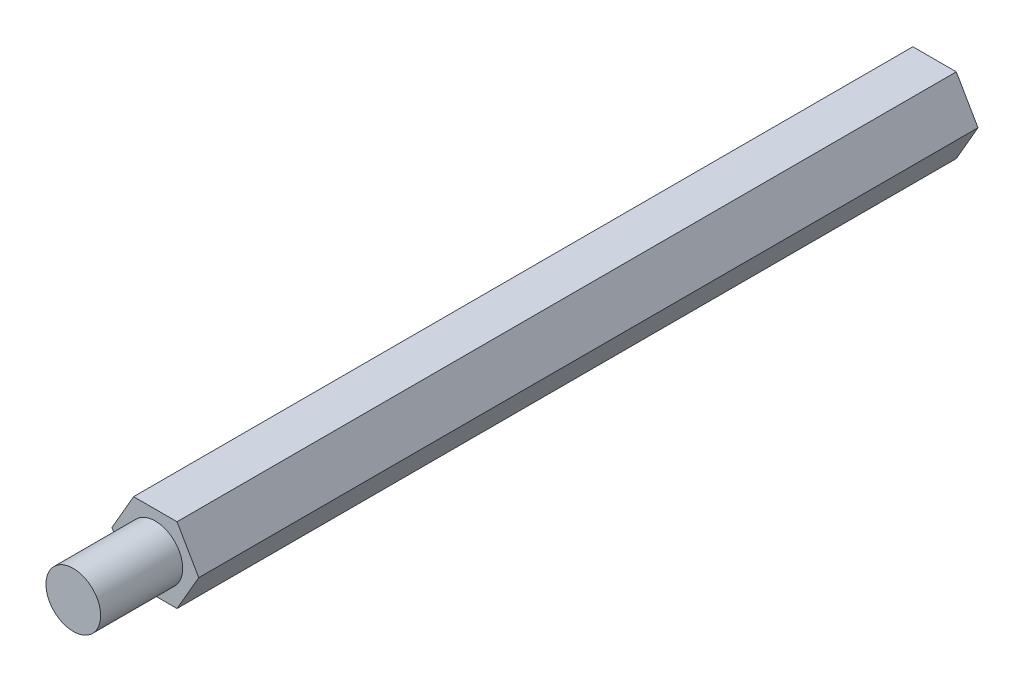
ISO-10303-21;
HEADER;
FILE_DESCRIPTION(('STEP AP214'),'2;1');
FILE_NAME('part.step','',(''),(''),'','','');
FILE_SCHEMA(('AUTOMOTIVE_DESIGN { 1 0 10303 214 1 1 1 1 }'));
ENDSEC;
DATA;
#1=APPLICATION_CONTEXT('core data for automotive mechanical design processes');
#2=APPLICATION_PROTOCOL_DEFINITION('international standard','automotive_design',2000,#1);
#3=PRODUCT_CONTEXT('',#1,'mechanical');
#4=PRODUCT('Part','Part','',(#3));
#5=PRODUCT_RELATED_PRODUCT_CATEGORY('part','',(#4));
#6=PRODUCT_DEFINITION_FORMATION('','',#4);
#7=PRODUCT_DEFINITION_CONTEXT('part definition',#1,'design');
#8=PRODUCT_DEFINITION('design','',#6,#7);
#9=PRODUCT_DEFINITION_SHAPE('','',#8);
#10=(LENGTH_UNIT() NAMED_UNIT(*) SI_UNIT(.MILLI.,.METRE.));
#11=(NAMED_UNIT(*) PLANE_ANGLE_UNIT() SI_UNIT($,.RADIAN.));
#12=(NAMED_UNIT(*) SI_UNIT($,.STERADIAN.) SOLID_ANGLE_UNIT());
#13=UNCERTAINTY_MEASURE_WITH_UNIT(LENGTH_MEASURE(1.E-05),#10,'distance_accuracy_value','');
#14=(GEOMETRIC_REPRESENTATION_CONTEXT(3) GLOBAL_UNCERTAINTY_ASSIGNED_CONTEXT((#13)) GLOBAL_UNIT_ASSIGNED_CONTEXT((#10,
#11,#12)) REPRESENTATION_CONTEXT('',''));
#15=CARTESIAN_POINT('',(0.,0.,0.));
#16=DIRECTION('',(0.,0.,1.));
#17=DIRECTION('',(1.,0.,0.));
#18=AXIS2_PLACEMENT_3D('',#15,#16,#17);
#19=CARTESIAN_POINT('',(1.58771324027147,-2.75,57.));
#20=DIRECTION('',(0.,0.,1.));
#21=DIRECTION('',(1.,0.,0.));
#22=AXIS2_PLACEMENT_3D('',#19,#20,#21);
#23=PLANE('',#22);
#24=DIRECTION('',(1.,0.,0.));
#25=VECTOR('',#24,1.);
#26=CARTESIAN_POINT('',(-1.58771324027147,-2.75,57.));
#27=LINE('',#26,#25);
#28=CARTESIAN_POINT('',(-1.58771324027147,-2.75,57.));
#29=VERTEX_POINT('',#28);
#30=CARTESIAN_POINT('',(1.58771324027147,-2.75,57.));
#31=VERTEX_POINT('',#30);
#32=EDGE_CURVE('E129',#29,#31,#27,.T.);
#33=ORIENTED_EDGE('',*,*,#32,.T.);
#34=DIRECTION('',(0.5,0.866025403784439,0.));
#35=VECTOR('',#34,1.);
#36=CARTESIAN_POINT('',(1.58771324027147,-2.75,57.));
#37=LINE('',#36,#35);
#38=CARTESIAN_POINT('',(3.17542648054294,0.,57.));
#39=VERTEX_POINT('',#38);
#40=EDGE_CURVE('E87',#31,#39,#37,.T.);
#41=ORIENTED_EDGE('',*,*,#40,.T.);
#42=DIRECTION('',(-0.5,0.866025403784438,0.));
#43=VECTOR('',#42,1.);
#44=CARTESIAN_POINT('',(3.17542648054294,0.,57.));
#45=LINE('',#44,#43);
#46=CARTESIAN_POINT('',(1.58771324027147,2.75,57.));
#47=VERTEX_POINT('',#46);
#48=EDGE_CURVE('E100',#39,#47,#45,.T.);
#49=ORIENTED_EDGE('',*,*,#48,.T.);
#50=DIRECTION('',(-1.,0.,0.));
#51=VECTOR('',#50,1.);
#52=CARTESIAN_POINT('',(1.58771324027147,2.75,57.));
#53=LINE('',#52,#51);
#54=CARTESIAN_POINT('',(-1.58771324027147,2.75,57.));
#55=VERTEX_POINT('',#54);
#56=EDGE_CURVE('E94',#47,#55,#53,.T.);
#57=ORIENTED_EDGE('',*,*,#56,.T.);
#58=DIRECTION('',(-0.5,-0.866025403784439,0.));
#59=VECTOR('',#58,1.);
#60=CARTESIAN_POINT('',(-1.58771324027147,2.75,57.));
#61=LINE('',#60,#59);
#62=CARTESIAN_POINT('',(-3.17542648054294,0.,57.));
#63=VERTEX_POINT('',#62);
#64=EDGE_CURVE('E98',#55,#63,#61,.T.);
#65=ORIENTED_EDGE('',*,*,#64,.T.);
#66=DIRECTION('',(0.5,-0.866025403784438,0.));
#67=VECTOR('',#66,1.);
#68=CARTESIAN_POINT('',(-3.17542648054294,0.,57.));
#69=LINE('',#68,#67);
#70=EDGE_CURVE('E50',#63,#29,#69,.T.);
#71=ORIENTED_EDGE('',*,*,#70,.T.);
#72=EDGE_LOOP('',(#33,#41,#49,#57,#65,#71));
#73=FACE_BOUND('',#72,.T.);
#74=CARTESIAN_POINT('',(0.,0.,57.));
#75=DIRECTION('',(0.,0.,1.));
#76=DIRECTION('',(1.,0.,0.));
#77=AXIS2_PLACEMENT_3D('',#74,#75,#76);
#78=CIRCLE('',#77,2.);
#79=CARTESIAN_POINT('',(2.,0.,57.));
#80=VERTEX_POINT('',#79);
#81=EDGE_CURVE('E179',#80,#80,#78,.T.);
#82=ORIENTED_EDGE('',*,*,#81,.F.);
#83=EDGE_LOOP('',(#82));
#84=FACE_BOUND('',#83,.T.);
#85=ADVANCED_FACE('F33',(#73,#84),#23,.T.);
#86=CARTESIAN_POINT('',(-1.58771324027147,-2.75,57.));
#87=DIRECTION('',(0.,1.,0.));
#88=DIRECTION('',(0.,0.,1.));
#89=AXIS2_PLACEMENT_3D('',#86,#87,#88);
#90=PLANE('',#89);
#91=DIRECTION('',(1.,0.,0.));
#92=VECTOR('',#91,1.);
#93=CARTESIAN_POINT('',(-1.58771324027147,-2.75,0.));
#94=LINE('',#93,#92);
#95=CARTESIAN_POINT('',(-1.58771324027147,-2.75,0.));
#96=VERTEX_POINT('',#95);
#97=CARTESIAN_POINT('',(1.58771324027147,-2.75,0.));
#98=VERTEX_POINT('',#97);
#99=EDGE_CURVE('E118',#96,#98,#94,.T.);
#100=ORIENTED_EDGE('',*,*,#99,.T.);
#101=DIRECTION('',(0.,0.,-1.));
#102=VECTOR('',#101,1.);
#103=CARTESIAN_POINT('',(1.58771324027147,-2.75,57.));
#104=LINE('',#103,#102);
#105=EDGE_CURVE('E11',#31,#98,#104,.T.);
#106=ORIENTED_EDGE('',*,*,#105,.F.);
#107=ORIENTED_EDGE('',*,*,#32,.F.);
#108=DIRECTION('',(0.,0.,-1.));
#109=VECTOR('',#108,1.);
#110=CARTESIAN_POINT('',(-1.58771324027147,-2.75,57.));
#111=LINE('',#110,#109);
#112=EDGE_CURVE('E114',#29,#96,#111,.T.);
#113=ORIENTED_EDGE('',*,*,#112,.T.);
#114=EDGE_LOOP('',(#100,#106,#107,#113));
#115=FACE_BOUND('',#114,.T.);
#116=ADVANCED_FACE('F35',(#115),#90,.F.);
#117=CARTESIAN_POINT('',(1.58771324027147,-2.75,57.));
#118=DIRECTION('',(-0.866025403784439,0.5,0.));
#119=DIRECTION('',(-0.5,-0.866025403784439,0.));
#120=AXIS2_PLACEMENT_3D('',#117,#118,#119);
#121=PLANE('',#120);
#122=DIRECTION('',(0.5,0.866025403784439,0.));
#123=VECTOR('',#122,1.);
#124=CARTESIAN_POINT('',(1.58771324027147,-2.75,0.));
#125=LINE('',#124,#123);
#126=CARTESIAN_POINT('',(3.17542648054294,0.,0.));
#127=VERTEX_POINT('',#126);
#128=EDGE_CURVE('E121',#98,#127,#125,.T.);
#129=ORIENTED_EDGE('',*,*,#128,.T.);
#130=DIRECTION('',(0.,0.,-1.));
#131=VECTOR('',#130,1.);
#132=CARTESIAN_POINT('',(3.17542648054294,0.,57.));
#133=LINE('',#132,#131);
#134=EDGE_CURVE('E42',#39,#127,#133,.T.);
#135=ORIENTED_EDGE('',*,*,#134,.F.);
#136=ORIENTED_EDGE('',*,*,#40,.F.);
#137=ORIENTED_EDGE('',*,*,#105,.T.);
#138=EDGE_LOOP('',(#129,#135,#136,#137));
#139=FACE_BOUND('',#138,.T.);
#140=ADVANCED_FACE('F158',(#139),#121,.F.);
#141=CARTESIAN_POINT('',(3.17542648054294,0.,57.));
#142=DIRECTION('',(-0.866025403784438,-0.5,0.));
#143=DIRECTION('',(0.5,-0.866025403784439,0.));
#144=AXIS2_PLACEMENT_3D('',#141,#142,#143);
#145=PLANE('',#144);
#146=DIRECTION('',(-0.5,0.866025403784438,0.));
#147=VECTOR('',#146,1.);
#148=CARTESIAN_POINT('',(3.17542648054294,0.,0.));
#149=LINE('',#148,#147);
#150=CARTESIAN_POINT('',(1.58771324027147,2.75,0.));
#151=VERTEX_POINT('',#150);
#152=EDGE_CURVE('E124',#127,#151,#149,.T.);
#153=ORIENTED_EDGE('',*,*,#152,.T.);
#154=DIRECTION('',(0.,0.,-1.));
#155=VECTOR('',#154,1.);
#156=CARTESIAN_POINT('',(1.58771324027147,2.75,57.));
#157=LINE('',#156,#155);
#158=EDGE_CURVE('E109',#47,#151,#157,.T.);
#159=ORIENTED_EDGE('',*,*,#158,.F.);
#160=ORIENTED_EDGE('',*,*,#48,.F.);
#161=ORIENTED_EDGE('',*,*,#134,.T.);
#162=EDGE_LOOP('',(#153,#159,#160,#161));
#163=FACE_BOUND('',#162,.T.);
#164=ADVANCED_FACE('F135',(#163),#145,.F.);
#165=CARTESIAN_POINT('',(1.58771324027147,2.75,57.));
#166=DIRECTION('',(0.,-1.,0.));
#167=DIRECTION('',(0.,0.,-1.));
#168=AXIS2_PLACEMENT_3D('',#165,#166,#167);
#169=PLANE('',#168);
#170=DIRECTION('',(-1.,0.,0.));
#171=VECTOR('',#170,1.);
#172=CARTESIAN_POINT('',(1.58771324027147,2.75,0.));
#173=LINE('',#172,#171);
#174=CARTESIAN_POINT('',(-1.58771324027147,2.75,0.));
#175=VERTEX_POINT('',#174);
#176=EDGE_CURVE('E108',#151,#175,#173,.T.);
#177=ORIENTED_EDGE('',*,*,#176,.T.);
#178=DIRECTION('',(0.,0.,-1.));
#179=VECTOR('',#178,1.);
#180=CARTESIAN_POINT('',(-1.58771324027147,2.75,57.));
#181=LINE('',#180,#179);
#182=EDGE_CURVE('E105',#55,#175,#181,.T.);
#183=ORIENTED_EDGE('',*,*,#182,.F.);
#184=ORIENTED_EDGE('',*,*,#56,.F.);
#185=ORIENTED_EDGE('',*,*,#158,.T.);
#186=EDGE_LOOP('',(#177,#183,#184,#185));
#187=FACE_BOUND('',#186,.T.);
#188=ADVANCED_FACE('F106',(#187),#169,.F.);
#189=CARTESIAN_POINT('',(-1.58771324027147,2.75,57.));
#190=DIRECTION('',(0.866025403784439,-0.5,0.));
#191=DIRECTION('',(0.5,0.866025403784439,0.));
#192=AXIS2_PLACEMENT_3D('',#189,#190,#191);
#193=PLANE('',#192);
#194=DIRECTION('',(-0.5,-0.866025403784439,0.));
#195=VECTOR('',#194,1.);
#196=CARTESIAN_POINT('',(-1.58771324027147,2.75,0.));
#197=LINE('',#196,#195);
#198=CARTESIAN_POINT('',(-3.17542648054294,0.,0.));
#199=VERTEX_POINT('',#198);
#200=EDGE_CURVE('E73',#175,#199,#197,.T.);
#201=ORIENTED_EDGE('',*,*,#200,.T.);
#202=DIRECTION('',(0.,0.,-1.));
#203=VECTOR('',#202,1.);
#204=CARTESIAN_POINT('',(-3.17542648054294,0.,57.));
#205=LINE('',#204,#203);
#206=EDGE_CURVE('E110',#63,#199,#205,.T.);
#207=ORIENTED_EDGE('',*,*,#206,.F.);
#208=ORIENTED_EDGE('',*,*,#64,.F.);
#209=ORIENTED_EDGE('',*,*,#182,.T.);
#210=EDGE_LOOP('',(#201,#207,#208,#209));
#211=FACE_BOUND('',#210,.T.);
#212=ADVANCED_FACE('F112',(#211),#193,.F.);
#213=CARTESIAN_POINT('',(-3.17542648054294,0.,57.));
#214=DIRECTION('',(0.866025403784438,0.5,0.));
#215=DIRECTION('',(-0.5,0.866025403784439,0.));
#216=AXIS2_PLACEMENT_3D('',#213,#214,#215);
#217=PLANE('',#216);
#218=DIRECTION('',(0.5,-0.866025403784438,0.));
#219=VECTOR('',#218,1.);
#220=CARTESIAN_POINT('',(-3.17542648054294,0.,0.));
#221=LINE('',#220,#219);
#222=EDGE_CURVE('E79',#199,#96,#221,.T.);
#223=ORIENTED_EDGE('',*,*,#222,.T.);
#224=ORIENTED_EDGE('',*,*,#112,.F.);
#225=ORIENTED_EDGE('',*,*,#70,.F.);
#226=ORIENTED_EDGE('',*,*,#206,.T.);
#227=EDGE_LOOP('',(#223,#224,#225,#226));
#228=FACE_BOUND('',#227,.T.);
#229=ADVANCED_FACE('F142',(#228),#217,.F.);
#230=CARTESIAN_POINT('',(1.58771324027147,-2.75,0.));
#231=DIRECTION('',(0.,0.,1.));
#232=DIRECTION('',(1.,0.,0.));
#233=AXIS2_PLACEMENT_3D('',#230,#231,#232);
#234=PLANE('',#233);
#235=CARTESIAN_POINT('',(0.,0.,0.));
#236=DIRECTION('',(0.,0.,-1.));
#237=DIRECTION('',(-1.,0.,0.));
#238=AXIS2_PLACEMENT_3D('',#235,#236,#237);
#239=CIRCLE('',#238,1.5);
#240=CARTESIAN_POINT('',(-1.5,0.,0.));
#241=VERTEX_POINT('',#240);
#242=EDGE_CURVE('E180',#241,#241,#239,.T.);
#243=ORIENTED_EDGE('',*,*,#242,.F.);
#244=EDGE_LOOP('',(#243));
#245=FACE_BOUND('',#244,.T.);
#246=ORIENTED_EDGE('',*,*,#99,.F.);
#247=ORIENTED_EDGE('',*,*,#222,.F.);
#248=ORIENTED_EDGE('',*,*,#200,.F.);
#249=ORIENTED_EDGE('',*,*,#176,.F.);
#250=ORIENTED_EDGE('',*,*,#152,.F.);
#251=ORIENTED_EDGE('',*,*,#128,.F.);
#252=EDGE_LOOP('',(#246,#247,#248,#249,#250,#251));
#253=FACE_BOUND('',#252,.T.);
#254=ADVANCED_FACE('F138',(#245,#253),#234,.F.);
#255=CARTESIAN_POINT('',(0.,0.,63.));
#256=DIRECTION('',(0.,0.,-1.));
#257=DIRECTION('',(-1.,0.,0.));
#258=AXIS2_PLACEMENT_3D('',#255,#256,#257);
#259=CYLINDRICAL_SURFACE('',#258,2.);
#260=CARTESIAN_POINT('',(0.,0.,63.));
#261=DIRECTION('',(0.,0.,1.));
#262=DIRECTION('',(1.,0.,0.));
#263=AXIS2_PLACEMENT_3D('',#260,#261,#262);
#264=CIRCLE('',#263,2.);
#265=CARTESIAN_POINT('',(2.,0.,63.));
#266=VERTEX_POINT('',#265);
#267=EDGE_CURVE('E122',#266,#266,#264,.T.);
#268=ORIENTED_EDGE('',*,*,#267,.F.);
#269=EDGE_LOOP('',(#268));
#270=FACE_BOUND('',#269,.T.);
#271=ORIENTED_EDGE('',*,*,#81,.T.);
#272=EDGE_LOOP('',(#271));
#273=FACE_BOUND('',#272,.T.);
#274=ADVANCED_FACE('F149',(#270,#273),#259,.T.);
#275=CARTESIAN_POINT('',(0.,0.,63.));
#276=DIRECTION('',(0.,0.,1.));
#277=DIRECTION('',(1.,0.,0.));
#278=AXIS2_PLACEMENT_3D('',#275,#276,#277);
#279=PLANE('',#278);
#280=ORIENTED_EDGE('',*,*,#267,.T.);
#281=EDGE_LOOP('',(#280));
#282=FACE_BOUND('',#281,.T.);
#283=ADVANCED_FACE('F162',(#282),#279,.T.);
#284=CARTESIAN_POINT('',(0.,0.,5.));
#285=DIRECTION('',(0.,0.,-1.));
#286=DIRECTION('',(-1.,0.,0.));
#287=AXIS2_PLACEMENT_3D('',#284,#285,#286);
#288=CYLINDRICAL_SURFACE('',#287,1.5);
#289=CARTESIAN_POINT('',(0.,0.,5.));
#290=DIRECTION('',(0.,0.,-1.));
#291=DIRECTION('',(-1.,0.,0.));
#292=AXIS2_PLACEMENT_3D('',#289,#290,#291);
#293=CIRCLE('',#292,1.5);
#294=CARTESIAN_POINT('',(-1.5,0.,5.));
#295=VERTEX_POINT('',#294);
#296=EDGE_CURVE('E178',#295,#295,#293,.T.);
#297=ORIENTED_EDGE('',*,*,#296,.F.);
#298=EDGE_LOOP('',(#297));
#299=FACE_BOUND('',#298,.T.);
#300=ORIENTED_EDGE('',*,*,#242,.T.);
#301=EDGE_LOOP('',(#300));
#302=FACE_BOUND('',#301,.T.);
#303=ADVANCED_FACE('F166',(#299,#302),#288,.F.);
#304=CARTESIAN_POINT('',(0.,0.,5.));
#305=DIRECTION('',(0.,0.,-1.));
#306=DIRECTION('',(-1.,0.,0.));
#307=AXIS2_PLACEMENT_3D('',#304,#305,#306);
#308=PLANE('',#307);
#309=ORIENTED_EDGE('',*,*,#296,.T.);
#310=EDGE_LOOP('',(#309));
#311=FACE_BOUND('',#310,.T.);
#312=ADVANCED_FACE('F170',(#311),#308,.T.);
#313=CLOSED_SHELL('',(#85,#116,#140,#164,#188,#212,#229,#254,#274,#283,#303,#312));
#314=MANIFOLD_SOLID_BREP('B2',#313);
#315=ADVANCED_BREP_SHAPE_REPRESENTATION('',(#18,#314),#14);
#316=SHAPE_DEFINITION_REPRESENTATION(#9,#315);
ENDSEC;
END-ISO-10303-21;
